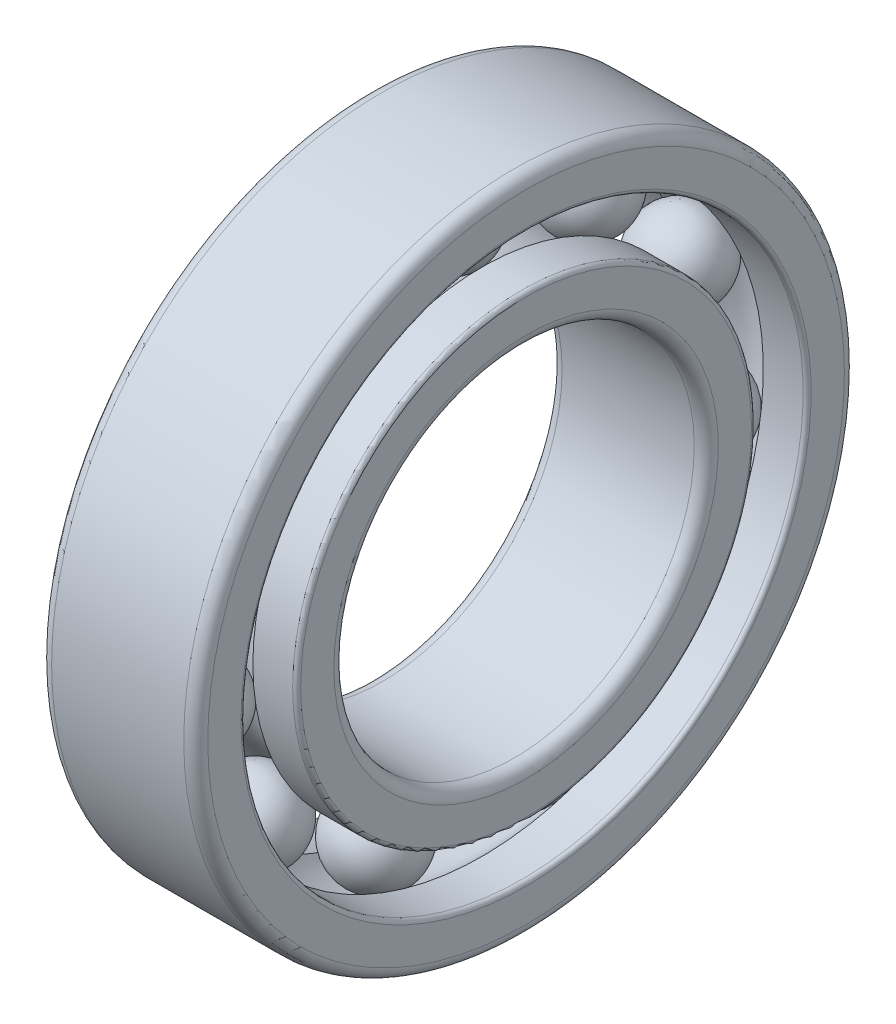
ISO-10303-21;
HEADER;
FILE_DESCRIPTION(('STEP AP214'),'2;1');
FILE_NAME('part.step','',(''),(''),'','','');
FILE_SCHEMA(('AUTOMOTIVE_DESIGN { 1 0 10303 214 1 1 1 1 }'));
ENDSEC;
DATA;
#1=APPLICATION_CONTEXT('core data for automotive mechanical design processes');
#2=APPLICATION_PROTOCOL_DEFINITION('international standard','automotive_design',2000,#1);
#3=PRODUCT_CONTEXT('',#1,'mechanical');
#4=PRODUCT('Part','Part','',(#3));
#5=PRODUCT_RELATED_PRODUCT_CATEGORY('part','',(#4));
#6=PRODUCT_DEFINITION_FORMATION('','',#4);
#7=PRODUCT_DEFINITION_CONTEXT('part definition',#1,'design');
#8=PRODUCT_DEFINITION('design','',#6,#7);
#9=PRODUCT_DEFINITION_SHAPE('','',#8);
#10=(LENGTH_UNIT() NAMED_UNIT(*) SI_UNIT(.MILLI.,.METRE.));
#11=(NAMED_UNIT(*) PLANE_ANGLE_UNIT() SI_UNIT($,.RADIAN.));
#12=(NAMED_UNIT(*) SI_UNIT($,.STERADIAN.) SOLID_ANGLE_UNIT());
#13=UNCERTAINTY_MEASURE_WITH_UNIT(LENGTH_MEASURE(1.E-05),#10,'distance_accuracy_value','');
#14=(GEOMETRIC_REPRESENTATION_CONTEXT(3) GLOBAL_UNCERTAINTY_ASSIGNED_CONTEXT((#13)) GLOBAL_UNIT_ASSIGNED_CONTEXT((#10,
#11,#12)) REPRESENTATION_CONTEXT('',''));
#15=CARTESIAN_POINT('',(0.,0.,0.));
#16=DIRECTION('',(0.,0.,1.));
#17=DIRECTION('',(1.,0.,0.));
#18=AXIS2_PLACEMENT_3D('',#15,#16,#17);
#19=CARTESIAN_POINT('',(6.5,17.876637572663,-11.488617370932));
#20=DIRECTION('',(-1.,0.,0.));
#21=DIRECTION('',(0.,1.,0.));
#22=AXIS2_PLACEMENT_3D('',#19,#20,#21);
#23=SPHERICAL_SURFACE('',#22,3.572);
#24=CARTESIAN_POINT('',(10.072,17.876637572663,-11.488617370932));
#25=VERTEX_POINT('',#24);
#26=VERTEX_LOOP('',#25);
#27=FACE_BOUND('',#26,.T.);
#28=ADVANCED_FACE('P0_F15',(#27),#23,.T.);
#29=CLOSED_SHELL('',(#28));
#30=MANIFOLD_SOLID_BREP('P0_B1',#29);
#31=CARTESIAN_POINT('',(6.5,17.876637572663,11.488617370931));
#32=DIRECTION('',(-1.,0.,0.));
#33=DIRECTION('',(0.,1.,0.));
#34=AXIS2_PLACEMENT_3D('',#31,#32,#33);
#35=SPHERICAL_SURFACE('',#34,3.572);
#36=CARTESIAN_POINT('',(10.072,17.876637572663,11.488617370931));
#37=VERTEX_POINT('',#36);
#38=VERTEX_LOOP('',#37);
#39=FACE_BOUND('',#38,.T.);
#40=ADVANCED_FACE('P1_F15',(#39),#35,.T.);
#41=CLOSED_SHELL('',(#40));
#42=MANIFOLD_SOLID_BREP('P1_B1',#41);
#43=CARTESIAN_POINT('',(6.5,21.25,0.));
#44=DIRECTION('',(-1.,0.,0.));
#45=DIRECTION('',(0.,1.,0.));
#46=AXIS2_PLACEMENT_3D('',#43,#44,#45);
#47=SPHERICAL_SURFACE('',#46,3.572);
#48=CARTESIAN_POINT('',(10.072,21.25,0.));
#49=VERTEX_POINT('',#48);
#50=VERTEX_LOOP('',#49);
#51=FACE_BOUND('',#50,.T.);
#52=ADVANCED_FACE('P2_F15',(#51),#47,.T.);
#53=CLOSED_SHELL('',(#52));
#54=MANIFOLD_SOLID_BREP('P2_B1',#53);
#55=CARTESIAN_POINT('',(6.5,8.82756902629,-19.329679901284));
#56=DIRECTION('',(-1.,0.,0.));
#57=DIRECTION('',(0.,1.,0.));
#58=AXIS2_PLACEMENT_3D('',#55,#56,#57);
#59=SPHERICAL_SURFACE('',#58,3.572);
#60=CARTESIAN_POINT('',(10.072,8.82756902629,-19.329679901284));
#61=VERTEX_POINT('',#60);
#62=VERTEX_LOOP('',#61);
#63=FACE_BOUND('',#62,.T.);
#64=ADVANCED_FACE('P3_F15',(#63),#59,.T.);
#65=CLOSED_SHELL('',(#64));
#66=MANIFOLD_SOLID_BREP('P3_B1',#65);
#67=CARTESIAN_POINT('',(6.5,-3.024190313307,-21.03370563997));
#68=DIRECTION('',(-1.,0.,0.));
#69=DIRECTION('',(0.,1.,0.));
#70=AXIS2_PLACEMENT_3D('',#67,#68,#69);
#71=SPHERICAL_SURFACE('',#70,3.572);
#72=CARTESIAN_POINT('',(10.072,-3.024190313307,-21.03370563997));
#73=VERTEX_POINT('',#72);
#74=VERTEX_LOOP('',#73);
#75=FACE_BOUND('',#74,.T.);
#76=ADVANCED_FACE('P4_F15',(#75),#71,.T.);
#77=CLOSED_SHELL('',(#76));
#78=MANIFOLD_SOLID_BREP('P4_B1',#77);
#79=CARTESIAN_POINT('',(6.5,-13.915790596337,-16.059678455028));
#80=DIRECTION('',(-1.,0.,0.));
#81=DIRECTION('',(0.,1.,0.));
#82=AXIS2_PLACEMENT_3D('',#79,#80,#81);
#83=SPHERICAL_SURFACE('',#82,3.572);
#84=CARTESIAN_POINT('',(10.072,-13.915790596337,-16.059678455028));
#85=VERTEX_POINT('',#84);
#86=VERTEX_LOOP('',#85);
#87=FACE_BOUND('',#86,.T.);
#88=ADVANCED_FACE('P5_F15',(#87),#83,.T.);
#89=CLOSED_SHELL('',(#88));
#90=MANIFOLD_SOLID_BREP('P5_B1',#89);
#91=CARTESIAN_POINT('',(6.5,-20.389225689308,-5.98681683288));
#92=DIRECTION('',(-1.,0.,0.));
#93=DIRECTION('',(0.,1.,0.));
#94=AXIS2_PLACEMENT_3D('',#91,#92,#93);
#95=SPHERICAL_SURFACE('',#94,3.572);
#96=CARTESIAN_POINT('',(10.072,-20.389225689308,-5.98681683288));
#97=VERTEX_POINT('',#96);
#98=VERTEX_LOOP('',#97);
#99=FACE_BOUND('',#98,.T.);
#100=ADVANCED_FACE('P6_F15',(#99),#95,.T.);
#101=CLOSED_SHELL('',(#100));
#102=MANIFOLD_SOLID_BREP('P6_B1',#101);
#103=CARTESIAN_POINT('',(6.5,-20.389225689308,5.98681683288));
#104=DIRECTION('',(-1.,0.,0.));
#105=DIRECTION('',(0.,1.,0.));
#106=AXIS2_PLACEMENT_3D('',#103,#104,#105);
#107=SPHERICAL_SURFACE('',#106,3.572);
#108=CARTESIAN_POINT('',(10.072,-20.389225689308,5.98681683288));
#109=VERTEX_POINT('',#108);
#110=VERTEX_LOOP('',#109);
#111=FACE_BOUND('',#110,.T.);
#112=ADVANCED_FACE('P7_F15',(#111),#107,.T.);
#113=CLOSED_SHELL('',(#112));
#114=MANIFOLD_SOLID_BREP('P7_B1',#113);
#115=CARTESIAN_POINT('',(6.5,-13.915790596337,16.059678455028));
#116=DIRECTION('',(-1.,0.,0.));
#117=DIRECTION('',(0.,1.,0.));
#118=AXIS2_PLACEMENT_3D('',#115,#116,#117);
#119=SPHERICAL_SURFACE('',#118,3.572);
#120=CARTESIAN_POINT('',(10.072,-13.915790596337,16.059678455028));
#121=VERTEX_POINT('',#120);
#122=VERTEX_LOOP('',#121);
#123=FACE_BOUND('',#122,.T.);
#124=ADVANCED_FACE('P8_F15',(#123),#119,.T.);
#125=CLOSED_SHELL('',(#124));
#126=MANIFOLD_SOLID_BREP('P8_B1',#125);
#127=CARTESIAN_POINT('',(6.5,-3.024190313307,21.03370563997));
#128=DIRECTION('',(-1.,0.,0.));
#129=DIRECTION('',(0.,1.,0.));
#130=AXIS2_PLACEMENT_3D('',#127,#128,#129);
#131=SPHERICAL_SURFACE('',#130,3.572);
#132=CARTESIAN_POINT('',(10.072,-3.024190313307,21.03370563997));
#133=VERTEX_POINT('',#132);
#134=VERTEX_LOOP('',#133);
#135=FACE_BOUND('',#134,.T.);
#136=ADVANCED_FACE('P9_F15',(#135),#131,.T.);
#137=CLOSED_SHELL('',(#136));
#138=MANIFOLD_SOLID_BREP('P9_B1',#137);
#139=CARTESIAN_POINT('',(6.5,8.82756902629,19.329679901284));
#140=DIRECTION('',(-1.,0.,0.));
#141=DIRECTION('',(0.,1.,0.));
#142=AXIS2_PLACEMENT_3D('',#139,#140,#141);
#143=SPHERICAL_SURFACE('',#142,3.572);
#144=CARTESIAN_POINT('',(10.072,8.82756902629,19.329679901284));
#145=VERTEX_POINT('',#144);
#146=VERTEX_LOOP('',#145);
#147=FACE_BOUND('',#146,.T.);
#148=ADVANCED_FACE('P10_F15',(#147),#143,.T.);
#149=CLOSED_SHELL('',(#148));
#150=MANIFOLD_SOLID_BREP('P10_B1',#149);
#151=CARTESIAN_POINT('',(0.333333333333331,0.,0.));
#152=DIRECTION('',(1.,0.,0.));
#153=DIRECTION('',(0.,0.,1.));
#154=AXIS2_PLACEMENT_3D('',#151,#152,#153);
#155=TOROIDAL_SURFACE('',#154,18.7666666666667,0.333333333333331);
#156=CARTESIAN_POINT('',(0.333333333333338,0.,0.));
#157=DIRECTION('',(1.,0.,0.));
#158=DIRECTION('',(0.,0.,1.));
#159=AXIS2_PLACEMENT_3D('',#156,#157,#158);
#160=CIRCLE('',#159,19.1);
#161=CARTESIAN_POINT('',(0.333333333333338,0.,19.1));
#162=VERTEX_POINT('',#161);
#163=EDGE_CURVE('P11_E10',#162,#162,#160,.T.);
#164=ORIENTED_EDGE('',*,*,#163,.F.);
#165=EDGE_LOOP('',(#164));
#166=FACE_BOUND('',#165,.T.);
#167=CARTESIAN_POINT('',(0.,0.,0.));
#168=DIRECTION('',(1.,0.,0.));
#169=DIRECTION('',(0.,0.,1.));
#170=AXIS2_PLACEMENT_3D('',#167,#168,#169);
#171=CIRCLE('',#170,18.7666666666667);
#172=CARTESIAN_POINT('',(0.,0.,18.7666666666667));
#173=VERTEX_POINT('',#172);
#174=EDGE_CURVE('P11_E78',#173,#173,#171,.T.);
#175=ORIENTED_EDGE('',*,*,#174,.T.);
#176=EDGE_LOOP('',(#175));
#177=FACE_BOUND('',#176,.T.);
#178=ADVANCED_FACE('P11_F16',(#166,#177),#155,.T.);
#179=CARTESIAN_POINT('',(100.,0.,0.));
#180=DIRECTION('',(1.,0.,0.));
#181=DIRECTION('',(0.,0.,1.));
#182=AXIS2_PLACEMENT_3D('',#179,#180,#181);
#183=CYLINDRICAL_SURFACE('',#182,19.1);
#184=CARTESIAN_POINT('',(3.64751266435764,0.,0.));
#185=DIRECTION('',(1.,0.,0.));
#186=DIRECTION('',(0.,0.,1.));
#187=AXIS2_PLACEMENT_3D('',#184,#185,#186);
#188=CIRCLE('',#187,19.1);
#189=CARTESIAN_POINT('',(3.64751266435764,0.,19.1));
#190=VERTEX_POINT('',#189);
#191=EDGE_CURVE('P11_E25',#190,#190,#188,.T.);
#192=ORIENTED_EDGE('',*,*,#191,.F.);
#193=EDGE_LOOP('',(#192));
#194=FACE_BOUND('',#193,.T.);
#195=ORIENTED_EDGE('',*,*,#163,.T.);
#196=EDGE_LOOP('',(#195));
#197=FACE_BOUND('',#196,.T.);
#198=ADVANCED_FACE('P11_F18',(#194,#197),#183,.T.);
#199=CARTESIAN_POINT('',(6.5,0.,0.));
#200=DIRECTION('',(1.,0.,0.));
#201=DIRECTION('',(0.,0.,1.));
#202=AXIS2_PLACEMENT_3D('',#199,#200,#201);
#203=TOROIDAL_SURFACE('',#202,21.25,3.572);
#204=ORIENTED_EDGE('',*,*,#191,.T.);
#205=EDGE_LOOP('',(#204));
#206=FACE_BOUND('',#205,.T.);
#207=CARTESIAN_POINT('',(9.35248733564235,0.,0.));
#208=DIRECTION('',(1.,0.,0.));
#209=DIRECTION('',(0.,0.,1.));
#210=AXIS2_PLACEMENT_3D('',#207,#208,#209);
#211=CIRCLE('',#210,19.1);
#212=CARTESIAN_POINT('',(9.35248733564235,0.,19.1));
#213=VERTEX_POINT('',#212);
#214=EDGE_CURVE('P11_E99',#213,#213,#211,.T.);
#215=ORIENTED_EDGE('',*,*,#214,.F.);
#216=EDGE_LOOP('',(#215));
#217=FACE_BOUND('',#216,.T.);
#218=ADVANCED_FACE('P11_F208',(#206,#217),#203,.F.);
#219=CARTESIAN_POINT('',(100.,0.,0.));
#220=DIRECTION('',(1.,0.,0.));
#221=DIRECTION('',(0.,0.,1.));
#222=AXIS2_PLACEMENT_3D('',#219,#220,#221);
#223=CYLINDRICAL_SURFACE('',#222,19.1);
#224=CARTESIAN_POINT('',(12.6666666666667,0.,0.));
#225=DIRECTION('',(1.,0.,0.));
#226=DIRECTION('',(0.,0.,1.));
#227=AXIS2_PLACEMENT_3D('',#224,#225,#226);
#228=CIRCLE('',#227,19.1);
#229=CARTESIAN_POINT('',(12.6666666666667,0.,19.1));
#230=VERTEX_POINT('',#229);
#231=EDGE_CURVE('P11_E98',#230,#230,#228,.T.);
#232=ORIENTED_EDGE('',*,*,#231,.F.);
#233=EDGE_LOOP('',(#232));
#234=FACE_BOUND('',#233,.T.);
#235=ORIENTED_EDGE('',*,*,#214,.T.);
#236=EDGE_LOOP('',(#235));
#237=FACE_BOUND('',#236,.T.);
#238=ADVANCED_FACE('P11_F197',(#234,#237),#223,.T.);
#239=CARTESIAN_POINT('',(12.6666666666667,0.,0.));
#240=DIRECTION('',(1.,0.,0.));
#241=DIRECTION('',(0.,0.,1.));
#242=AXIS2_PLACEMENT_3D('',#239,#240,#241);
#243=TOROIDAL_SURFACE('',#242,18.7666666666667,0.333333333333335);
#244=CARTESIAN_POINT('',(13.,0.,0.));
#245=DIRECTION('',(1.,0.,0.));
#246=DIRECTION('',(0.,0.,1.));
#247=AXIS2_PLACEMENT_3D('',#244,#245,#246);
#248=CIRCLE('',#247,18.7666666666667);
#249=CARTESIAN_POINT('',(13.,0.,18.7666666666667));
#250=VERTEX_POINT('',#249);
#251=EDGE_CURVE('P11_E95',#250,#250,#248,.T.);
#252=ORIENTED_EDGE('',*,*,#251,.F.);
#253=EDGE_LOOP('',(#252));
#254=FACE_BOUND('',#253,.T.);
#255=ORIENTED_EDGE('',*,*,#231,.T.);
#256=EDGE_LOOP('',(#255));
#257=FACE_BOUND('',#256,.T.);
#258=ADVANCED_FACE('P11_F187',(#254,#257),#243,.T.);
#259=CARTESIAN_POINT('',(13.,-16.,0.));
#260=DIRECTION('',(1.,0.,0.));
#261=DIRECTION('',(0.,-1.,0.));
#262=AXIS2_PLACEMENT_3D('',#259,#260,#261);
#263=PLANE('',#262);
#264=CARTESIAN_POINT('',(13.,0.,0.));
#265=DIRECTION('',(1.,0.,0.));
#266=DIRECTION('',(0.,0.,1.));
#267=AXIS2_PLACEMENT_3D('',#264,#265,#266);
#268=CIRCLE('',#267,16.);
#269=CARTESIAN_POINT('',(13.,0.,16.));
#270=VERTEX_POINT('',#269);
#271=EDGE_CURVE('P11_E92',#270,#270,#268,.T.);
#272=ORIENTED_EDGE('',*,*,#271,.F.);
#273=EDGE_LOOP('',(#272));
#274=FACE_BOUND('',#273,.T.);
#275=ORIENTED_EDGE('',*,*,#251,.T.);
#276=EDGE_LOOP('',(#275));
#277=FACE_BOUND('',#276,.T.);
#278=ADVANCED_FACE('P11_F176',(#274,#277),#263,.T.);
#279=CARTESIAN_POINT('',(12.,0.,0.));
#280=DIRECTION('',(1.,0.,0.));
#281=DIRECTION('',(0.,0.,1.));
#282=AXIS2_PLACEMENT_3D('',#279,#280,#281);
#283=TOROIDAL_SURFACE('',#282,16.,1.);
#284=CARTESIAN_POINT('',(12.,0.,0.));
#285=DIRECTION('',(1.,0.,0.));
#286=DIRECTION('',(0.,0.,1.));
#287=AXIS2_PLACEMENT_3D('',#284,#285,#286);
#288=CIRCLE('',#287,15.);
#289=CARTESIAN_POINT('',(12.,0.,15.));
#290=VERTEX_POINT('',#289);
#291=EDGE_CURVE('P11_E89',#290,#290,#288,.T.);
#292=ORIENTED_EDGE('',*,*,#291,.F.);
#293=EDGE_LOOP('',(#292));
#294=FACE_BOUND('',#293,.T.);
#295=ORIENTED_EDGE('',*,*,#271,.T.);
#296=EDGE_LOOP('',(#295));
#297=FACE_BOUND('',#296,.T.);
#298=ADVANCED_FACE('P11_F164',(#294,#297),#283,.T.);
#299=CARTESIAN_POINT('',(100.,0.,0.));
#300=DIRECTION('',(1.,0.,0.));
#301=DIRECTION('',(0.,0.,1.));
#302=AXIS2_PLACEMENT_3D('',#299,#300,#301);
#303=CYLINDRICAL_SURFACE('',#302,15.);
#304=CARTESIAN_POINT('',(1.,0.,0.));
#305=DIRECTION('',(1.,0.,0.));
#306=DIRECTION('',(0.,0.,1.));
#307=AXIS2_PLACEMENT_3D('',#304,#305,#306);
#308=CIRCLE('',#307,15.);
#309=CARTESIAN_POINT('',(1.,0.,15.));
#310=VERTEX_POINT('',#309);
#311=EDGE_CURVE('P11_E84',#310,#310,#308,.T.);
#312=ORIENTED_EDGE('',*,*,#311,.F.);
#313=EDGE_LOOP('',(#312));
#314=FACE_BOUND('',#313,.T.);
#315=ORIENTED_EDGE('',*,*,#291,.T.);
#316=EDGE_LOOP('',(#315));
#317=FACE_BOUND('',#316,.T.);
#318=ADVANCED_FACE('P11_F153',(#314,#317),#303,.F.);
#319=CARTESIAN_POINT('',(1.,0.,0.));
#320=DIRECTION('',(1.,0.,0.));
#321=DIRECTION('',(0.,0.,1.));
#322=AXIS2_PLACEMENT_3D('',#319,#320,#321);
#323=TOROIDAL_SURFACE('',#322,16.,1.);
#324=CARTESIAN_POINT('',(0.,0.,0.));
#325=DIRECTION('',(1.,0.,0.));
#326=DIRECTION('',(0.,0.,1.));
#327=AXIS2_PLACEMENT_3D('',#324,#325,#326);
#328=CIRCLE('',#327,16.);
#329=CARTESIAN_POINT('',(0.,0.,16.));
#330=VERTEX_POINT('',#329);
#331=EDGE_CURVE('P11_E74',#330,#330,#328,.T.);
#332=ORIENTED_EDGE('',*,*,#331,.F.);
#333=EDGE_LOOP('',(#332));
#334=FACE_BOUND('',#333,.T.);
#335=ORIENTED_EDGE('',*,*,#311,.T.);
#336=EDGE_LOOP('',(#335));
#337=FACE_BOUND('',#336,.T.);
#338=ADVANCED_FACE('P11_F141',(#334,#337),#323,.T.);
#339=CARTESIAN_POINT('',(0.,-18.7666666666667,0.));
#340=DIRECTION('',(-1.,0.,0.));
#341=DIRECTION('',(0.,0.,-1.));
#342=AXIS2_PLACEMENT_3D('',#339,#340,#341);
#343=PLANE('',#342);
#344=ORIENTED_EDGE('',*,*,#174,.F.);
#345=EDGE_LOOP('',(#344));
#346=FACE_BOUND('',#345,.T.);
#347=ORIENTED_EDGE('',*,*,#331,.T.);
#348=EDGE_LOOP('',(#347));
#349=FACE_BOUND('',#348,.T.);
#350=ADVANCED_FACE('P11_F75',(#346,#349),#343,.T.);
#351=CLOSED_SHELL('',(#178,#198,#218,#238,#258,#278,#298,#318,#338,#350));
#352=MANIFOLD_SOLID_BREP('P11_B1',#351);
#353=CARTESIAN_POINT('',(50.,0.,0.));
#354=DIRECTION('',(1.,0.,0.));
#355=DIRECTION('',(0.,0.,1.));
#356=AXIS2_PLACEMENT_3D('',#353,#354,#355);
#357=CYLINDRICAL_SURFACE('',#356,27.5);
#358=CARTESIAN_POINT('',(12.,0.,0.));
#359=DIRECTION('',(1.,0.,0.));
#360=DIRECTION('',(0.,0.,1.));
#361=AXIS2_PLACEMENT_3D('',#358,#359,#360);
#362=CIRCLE('',#361,27.5);
#363=CARTESIAN_POINT('',(12.,0.,27.5));
#364=VERTEX_POINT('',#363);
#365=EDGE_CURVE('P12_E11',#364,#364,#362,.T.);
#366=ORIENTED_EDGE('',*,*,#365,.F.);
#367=EDGE_LOOP('',(#366));
#368=FACE_BOUND('',#367,.T.);
#369=CARTESIAN_POINT('',(1.,0.,0.));
#370=DIRECTION('',(1.,0.,0.));
#371=DIRECTION('',(0.,0.,1.));
#372=AXIS2_PLACEMENT_3D('',#369,#370,#371);
#373=CIRCLE('',#372,27.5);
#374=CARTESIAN_POINT('',(1.,0.,27.5));
#375=VERTEX_POINT('',#374);
#376=EDGE_CURVE('P12_E79',#375,#375,#373,.T.);
#377=ORIENTED_EDGE('',*,*,#376,.T.);
#378=EDGE_LOOP('',(#377));
#379=FACE_BOUND('',#378,.T.);
#380=ADVANCED_FACE('P12_F17',(#368,#379),#357,.T.);
#381=CARTESIAN_POINT('',(12.,0.,0.));
#382=DIRECTION('',(1.,0.,0.));
#383=DIRECTION('',(0.,0.,1.));
#384=AXIS2_PLACEMENT_3D('',#381,#382,#383);
#385=TOROIDAL_SURFACE('',#384,26.5,1.);
#386=CARTESIAN_POINT('',(13.,0.,0.));
#387=DIRECTION('',(1.,0.,0.));
#388=DIRECTION('',(0.,0.,1.));
#389=AXIS2_PLACEMENT_3D('',#386,#387,#388);
#390=CIRCLE('',#389,26.5);
#391=CARTESIAN_POINT('',(13.,0.,26.5));
#392=VERTEX_POINT('',#391);
#393=EDGE_CURVE('P12_E26',#392,#392,#390,.T.);
#394=ORIENTED_EDGE('',*,*,#393,.F.);
#395=EDGE_LOOP('',(#394));
#396=FACE_BOUND('',#395,.T.);
#397=ORIENTED_EDGE('',*,*,#365,.T.);
#398=EDGE_LOOP('',(#397));
#399=FACE_BOUND('',#398,.T.);
#400=ADVANCED_FACE('P12_F19',(#396,#399),#385,.T.);
#401=CARTESIAN_POINT('',(13.,-23.7333333333333,0.));
#402=DIRECTION('',(1.,0.,0.));
#403=DIRECTION('',(0.,-1.,0.));
#404=AXIS2_PLACEMENT_3D('',#401,#402,#403);
#405=PLANE('',#404);
#406=CARTESIAN_POINT('',(13.,0.,0.));
#407=DIRECTION('',(1.,0.,0.));
#408=DIRECTION('',(0.,0.,1.));
#409=AXIS2_PLACEMENT_3D('',#406,#407,#408);
#410=CIRCLE('',#409,23.7333333333333);
#411=CARTESIAN_POINT('',(13.,0.,23.7333333333333));
#412=VERTEX_POINT('',#411);
#413=EDGE_CURVE('P12_E97',#412,#412,#410,.T.);
#414=ORIENTED_EDGE('',*,*,#413,.F.);
#415=EDGE_LOOP('',(#414));
#416=FACE_BOUND('',#415,.T.);
#417=ORIENTED_EDGE('',*,*,#393,.T.);
#418=EDGE_LOOP('',(#417));
#419=FACE_BOUND('',#418,.T.);
#420=ADVANCED_FACE('P12_F209',(#416,#419),#405,.T.);
#421=CARTESIAN_POINT('',(12.6666666666667,0.,0.));
#422=DIRECTION('',(1.,0.,0.));
#423=DIRECTION('',(0.,0.,1.));
#424=AXIS2_PLACEMENT_3D('',#421,#422,#423);
#425=TOROIDAL_SURFACE('',#424,23.7333333333333,0.333333333333328);
#426=CARTESIAN_POINT('',(12.6666666666667,0.,0.));
#427=DIRECTION('',(1.,0.,0.));
#428=DIRECTION('',(0.,0.,1.));
#429=AXIS2_PLACEMENT_3D('',#426,#427,#428);
#430=CIRCLE('',#429,23.4);
#431=CARTESIAN_POINT('',(12.6666666666667,0.,23.4));
#432=VERTEX_POINT('',#431);
#433=EDGE_CURVE('P12_E94',#432,#432,#430,.T.);
#434=ORIENTED_EDGE('',*,*,#433,.F.);
#435=EDGE_LOOP('',(#434));
#436=FACE_BOUND('',#435,.T.);
#437=ORIENTED_EDGE('',*,*,#413,.T.);
#438=EDGE_LOOP('',(#437));
#439=FACE_BOUND('',#438,.T.);
#440=ADVANCED_FACE('P12_F198',(#436,#439),#425,.T.);
#441=CARTESIAN_POINT('',(50.,0.,0.));
#442=DIRECTION('',(1.,0.,0.));
#443=DIRECTION('',(0.,0.,1.));
#444=AXIS2_PLACEMENT_3D('',#441,#442,#443);
#445=CYLINDRICAL_SURFACE('',#444,23.4);
#446=CARTESIAN_POINT('',(9.35248733564235,0.,0.));
#447=DIRECTION('',(1.,0.,0.));
#448=DIRECTION('',(0.,0.,1.));
#449=AXIS2_PLACEMENT_3D('',#446,#447,#448);
#450=CIRCLE('',#449,23.4);
#451=CARTESIAN_POINT('',(9.35248733564235,0.,23.4));
#452=VERTEX_POINT('',#451);
#453=EDGE_CURVE('P12_E98',#452,#452,#450,.T.);
#454=ORIENTED_EDGE('',*,*,#453,.F.);
#455=EDGE_LOOP('',(#454));
#456=FACE_BOUND('',#455,.T.);
#457=ORIENTED_EDGE('',*,*,#433,.T.);
#458=EDGE_LOOP('',(#457));
#459=FACE_BOUND('',#458,.T.);
#460=ADVANCED_FACE('P12_F186',(#456,#459),#445,.F.);
#461=CARTESIAN_POINT('',(6.5,0.,0.));
#462=DIRECTION('',(1.,0.,0.));
#463=DIRECTION('',(0.,0.,1.));
#464=AXIS2_PLACEMENT_3D('',#461,#462,#463);
#465=TOROIDAL_SURFACE('',#464,21.25,3.572);
#466=ORIENTED_EDGE('',*,*,#453,.T.);
#467=EDGE_LOOP('',(#466));
#468=FACE_BOUND('',#467,.T.);
#469=CARTESIAN_POINT('',(3.64751266435764,0.,0.));
#470=DIRECTION('',(1.,0.,0.));
#471=DIRECTION('',(0.,0.,1.));
#472=AXIS2_PLACEMENT_3D('',#469,#470,#471);
#473=CIRCLE('',#472,23.4);
#474=CARTESIAN_POINT('',(3.64751266435764,0.,23.4));
#475=VERTEX_POINT('',#474);
#476=EDGE_CURVE('P12_E93',#475,#475,#473,.T.);
#477=ORIENTED_EDGE('',*,*,#476,.F.);
#478=EDGE_LOOP('',(#477));
#479=FACE_BOUND('',#478,.T.);
#480=ADVANCED_FACE('P12_F176',(#468,#479),#465,.F.);
#481=CARTESIAN_POINT('',(50.,0.,0.));
#482=DIRECTION('',(1.,0.,0.));
#483=DIRECTION('',(0.,0.,1.));
#484=AXIS2_PLACEMENT_3D('',#481,#482,#483);
#485=CYLINDRICAL_SURFACE('',#484,23.4);
#486=CARTESIAN_POINT('',(0.333333333333331,0.,0.));
#487=DIRECTION('',(1.,0.,0.));
#488=DIRECTION('',(0.,0.,1.));
#489=AXIS2_PLACEMENT_3D('',#486,#487,#488);
#490=CIRCLE('',#489,23.4);
#491=CARTESIAN_POINT('',(0.333333333333331,0.,23.4));
#492=VERTEX_POINT('',#491);
#493=EDGE_CURVE('P12_E90',#492,#492,#490,.T.);
#494=ORIENTED_EDGE('',*,*,#493,.F.);
#495=EDGE_LOOP('',(#494));
#496=FACE_BOUND('',#495,.T.);
#497=ORIENTED_EDGE('',*,*,#476,.T.);
#498=EDGE_LOOP('',(#497));
#499=FACE_BOUND('',#498,.T.);
#500=ADVANCED_FACE('P12_F165',(#496,#499),#485,.F.);
#501=CARTESIAN_POINT('',(0.333333333333323,0.,0.));
#502=DIRECTION('',(1.,0.,0.));
#503=DIRECTION('',(0.,0.,1.));
#504=AXIS2_PLACEMENT_3D('',#501,#502,#503);
#505=TOROIDAL_SURFACE('',#504,23.7333333333333,0.333333333333323);
#506=CARTESIAN_POINT('',(0.,0.,0.));
#507=DIRECTION('',(1.,0.,0.));
#508=DIRECTION('',(0.,0.,1.));
#509=AXIS2_PLACEMENT_3D('',#506,#507,#508);
#510=CIRCLE('',#509,23.7333333333333);
#511=CARTESIAN_POINT('',(0.,0.,23.7333333333333));
#512=VERTEX_POINT('',#511);
#513=EDGE_CURVE('P12_E85',#512,#512,#510,.T.);
#514=ORIENTED_EDGE('',*,*,#513,.F.);
#515=EDGE_LOOP('',(#514));
#516=FACE_BOUND('',#515,.T.);
#517=ORIENTED_EDGE('',*,*,#493,.T.);
#518=EDGE_LOOP('',(#517));
#519=FACE_BOUND('',#518,.T.);
#520=ADVANCED_FACE('P12_F155',(#516,#519),#505,.T.);
#521=CARTESIAN_POINT('',(0.,-26.5,0.));
#522=DIRECTION('',(-1.,0.,0.));
#523=DIRECTION('',(0.,0.,-1.));
#524=AXIS2_PLACEMENT_3D('',#521,#522,#523);
#525=PLANE('',#524);
#526=CARTESIAN_POINT('',(0.,0.,0.));
#527=DIRECTION('',(1.,0.,0.));
#528=DIRECTION('',(0.,0.,1.));
#529=AXIS2_PLACEMENT_3D('',#526,#527,#528);
#530=CIRCLE('',#529,26.5);
#531=CARTESIAN_POINT('',(0.,0.,26.5));
#532=VERTEX_POINT('',#531);
#533=EDGE_CURVE('P12_E75',#532,#532,#530,.T.);
#534=ORIENTED_EDGE('',*,*,#533,.F.);
#535=EDGE_LOOP('',(#534));
#536=FACE_BOUND('',#535,.T.);
#537=ORIENTED_EDGE('',*,*,#513,.T.);
#538=EDGE_LOOP('',(#537));
#539=FACE_BOUND('',#538,.T.);
#540=ADVANCED_FACE('P12_F143',(#536,#539),#525,.T.);
#541=CARTESIAN_POINT('',(1.,0.,0.));
#542=DIRECTION('',(1.,0.,0.));
#543=DIRECTION('',(0.,0.,1.));
#544=AXIS2_PLACEMENT_3D('',#541,#542,#543);
#545=TOROIDAL_SURFACE('',#544,26.5,1.);
#546=ORIENTED_EDGE('',*,*,#376,.F.);
#547=EDGE_LOOP('',(#546));
#548=FACE_BOUND('',#547,.T.);
#549=ORIENTED_EDGE('',*,*,#533,.T.);
#550=EDGE_LOOP('',(#549));
#551=FACE_BOUND('',#550,.T.);
#552=ADVANCED_FACE('P12_F76',(#548,#551),#545,.T.);
#553=CLOSED_SHELL('',(#380,#400,#420,#440,#460,#480,#500,#520,#540,#552));
#554=MANIFOLD_SOLID_BREP('P12_B1',#553);
#555=ADVANCED_BREP_SHAPE_REPRESENTATION('',(#18,#30,#42,#54,#66,#78,#90,#102,#114,#126,#138,
#150,#352,#554),#14);
#556=SHAPE_DEFINITION_REPRESENTATION(#9,#555);
ENDSEC;
END-ISO-10303-21;
